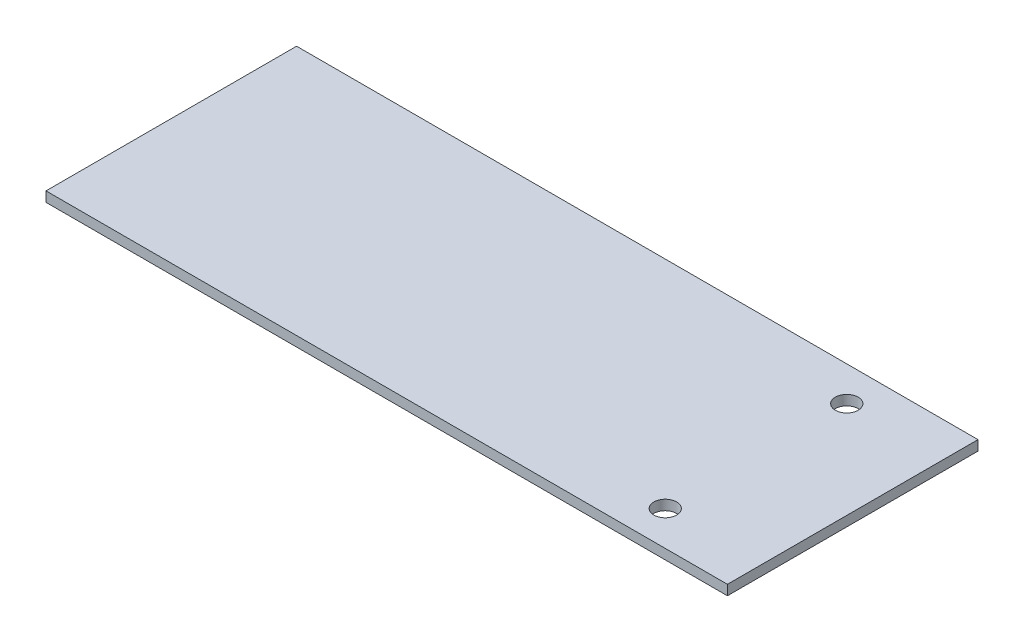
ISO-10303-21;
HEADER;
FILE_DESCRIPTION(('STEP AP214'),'2;1');
FILE_NAME('part.step','',(''),(''),'','','');
FILE_SCHEMA(('AUTOMOTIVE_DESIGN { 1 0 10303 214 1 1 1 1 }'));
ENDSEC;
DATA;
#1=APPLICATION_CONTEXT('core data for automotive mechanical design processes');
#2=APPLICATION_PROTOCOL_DEFINITION('international standard','automotive_design',2000,#1);
#3=PRODUCT_CONTEXT('',#1,'mechanical');
#4=PRODUCT('Part','Part','',(#3));
#5=PRODUCT_RELATED_PRODUCT_CATEGORY('part','',(#4));
#6=PRODUCT_DEFINITION_FORMATION('','',#4);
#7=PRODUCT_DEFINITION_CONTEXT('part definition',#1,'design');
#8=PRODUCT_DEFINITION('design','',#6,#7);
#9=PRODUCT_DEFINITION_SHAPE('','',#8);
#10=(LENGTH_UNIT() NAMED_UNIT(*) SI_UNIT(.MILLI.,.METRE.));
#11=(NAMED_UNIT(*) PLANE_ANGLE_UNIT() SI_UNIT($,.RADIAN.));
#12=(NAMED_UNIT(*) SI_UNIT($,.STERADIAN.) SOLID_ANGLE_UNIT());
#13=UNCERTAINTY_MEASURE_WITH_UNIT(LENGTH_MEASURE(1.E-05),#10,'distance_accuracy_value','');
#14=(GEOMETRIC_REPRESENTATION_CONTEXT(3) GLOBAL_UNCERTAINTY_ASSIGNED_CONTEXT((#13)) GLOBAL_UNIT_ASSIGNED_CONTEXT((#10,
#11,#12)) REPRESENTATION_CONTEXT('',''));
#15=CARTESIAN_POINT('',(0.,0.,0.));
#16=DIRECTION('',(0.,0.,1.));
#17=DIRECTION('',(1.,0.,0.));
#18=AXIS2_PLACEMENT_3D('',#15,#16,#17);
#19=CARTESIAN_POINT('',(56.985,1.67,20.955));
#20=DIRECTION('',(-1.,0.,0.));
#21=DIRECTION('',(0.,0.,1.));
#22=AXIS2_PLACEMENT_3D('',#19,#20,#21);
#23=PLANE('',#22);
#24=DIRECTION('',(0.,0.,-1.));
#25=VECTOR('',#24,1.);
#26=CARTESIAN_POINT('',(56.985,0.,20.955));
#27=LINE('',#26,#25);
#28=CARTESIAN_POINT('',(56.985,0.,20.955));
#29=VERTEX_POINT('',#28);
#30=CARTESIAN_POINT('',(56.985,0.,-20.955));
#31=VERTEX_POINT('',#30);
#32=EDGE_CURVE('E111',#29,#31,#27,.T.);
#33=ORIENTED_EDGE('',*,*,#32,.T.);
#34=DIRECTION('',(0.,-1.,0.));
#35=VECTOR('',#34,1.);
#36=CARTESIAN_POINT('',(56.985,1.67,-20.955));
#37=LINE('',#36,#35);
#38=CARTESIAN_POINT('',(56.985,1.67,-20.955));
#39=VERTEX_POINT('',#38);
#40=EDGE_CURVE('E11',#39,#31,#37,.T.);
#41=ORIENTED_EDGE('',*,*,#40,.F.);
#42=DIRECTION('',(0.,0.,-1.));
#43=VECTOR('',#42,1.);
#44=CARTESIAN_POINT('',(56.985,1.67,20.955));
#45=LINE('',#44,#43);
#46=CARTESIAN_POINT('',(56.985,1.67,20.955));
#47=VERTEX_POINT('',#46);
#48=EDGE_CURVE('E95',#47,#39,#45,.T.);
#49=ORIENTED_EDGE('',*,*,#48,.F.);
#50=DIRECTION('',(0.,-1.,0.));
#51=VECTOR('',#50,1.);
#52=CARTESIAN_POINT('',(56.985,1.67,20.955));
#53=LINE('',#52,#51);
#54=EDGE_CURVE('E107',#47,#29,#53,.T.);
#55=ORIENTED_EDGE('',*,*,#54,.T.);
#56=EDGE_LOOP('',(#33,#41,#49,#55));
#57=FACE_BOUND('',#56,.T.);
#58=ADVANCED_FACE('F43',(#57),#23,.F.);
#59=CARTESIAN_POINT('',(-56.985,1.67,-20.955));
#60=DIRECTION('',(0.,0.,1.));
#61=DIRECTION('',(1.,0.,0.));
#62=AXIS2_PLACEMENT_3D('',#59,#60,#61);
#63=PLANE('',#62);
#64=DIRECTION('',(-1.,0.,0.));
#65=VECTOR('',#64,1.);
#66=CARTESIAN_POINT('',(-56.985,0.,-20.955));
#67=LINE('',#66,#65);
#68=CARTESIAN_POINT('',(-56.985,0.,-20.955));
#69=VERTEX_POINT('',#68);
#70=EDGE_CURVE('E100',#31,#69,#67,.T.);
#71=ORIENTED_EDGE('',*,*,#70,.T.);
#72=DIRECTION('',(0.,-1.,0.));
#73=VECTOR('',#72,1.);
#74=CARTESIAN_POINT('',(-56.985,1.67,-20.955));
#75=LINE('',#74,#73);
#76=CARTESIAN_POINT('',(-56.985,1.67,-20.955));
#77=VERTEX_POINT('',#76);
#78=EDGE_CURVE('E52',#77,#69,#75,.T.);
#79=ORIENTED_EDGE('',*,*,#78,.F.);
#80=DIRECTION('',(-1.,0.,0.));
#81=VECTOR('',#80,1.);
#82=CARTESIAN_POINT('',(-56.985,1.67,-20.955));
#83=LINE('',#82,#81);
#84=EDGE_CURVE('E90',#39,#77,#83,.T.);
#85=ORIENTED_EDGE('',*,*,#84,.F.);
#86=ORIENTED_EDGE('',*,*,#40,.T.);
#87=EDGE_LOOP('',(#71,#79,#85,#86));
#88=FACE_BOUND('',#87,.T.);
#89=ADVANCED_FACE('F99',(#88),#63,.F.);
#90=CARTESIAN_POINT('',(-56.985,1.67,20.955));
#91=DIRECTION('',(1.,0.,0.));
#92=DIRECTION('',(0.,0.,-1.));
#93=AXIS2_PLACEMENT_3D('',#90,#91,#92);
#94=PLANE('',#93);
#95=DIRECTION('',(0.,0.,1.));
#96=VECTOR('',#95,1.);
#97=CARTESIAN_POINT('',(-56.985,0.,20.955));
#98=LINE('',#97,#96);
#99=CARTESIAN_POINT('',(-56.985,0.,20.955));
#100=VERTEX_POINT('',#99);
#101=EDGE_CURVE('E77',#69,#100,#98,.T.);
#102=ORIENTED_EDGE('',*,*,#101,.T.);
#103=DIRECTION('',(0.,-1.,0.));
#104=VECTOR('',#103,1.);
#105=CARTESIAN_POINT('',(-56.985,1.67,20.955));
#106=LINE('',#105,#104);
#107=CARTESIAN_POINT('',(-56.985,1.67,20.955));
#108=VERTEX_POINT('',#107);
#109=EDGE_CURVE('E102',#108,#100,#106,.T.);
#110=ORIENTED_EDGE('',*,*,#109,.F.);
#111=DIRECTION('',(0.,0.,1.));
#112=VECTOR('',#111,1.);
#113=CARTESIAN_POINT('',(-56.985,1.67,20.955));
#114=LINE('',#113,#112);
#115=EDGE_CURVE('E93',#77,#108,#114,.T.);
#116=ORIENTED_EDGE('',*,*,#115,.F.);
#117=ORIENTED_EDGE('',*,*,#78,.T.);
#118=EDGE_LOOP('',(#102,#110,#116,#117));
#119=FACE_BOUND('',#118,.T.);
#120=ADVANCED_FACE('F103',(#119),#94,.F.);
#121=CARTESIAN_POINT('',(-56.985,1.67,20.955));
#122=DIRECTION('',(0.,0.,-1.));
#123=DIRECTION('',(-1.,0.,0.));
#124=AXIS2_PLACEMENT_3D('',#121,#122,#123);
#125=PLANE('',#124);
#126=DIRECTION('',(1.,0.,0.));
#127=VECTOR('',#126,1.);
#128=CARTESIAN_POINT('',(-56.985,0.,20.955));
#129=LINE('',#128,#127);
#130=EDGE_CURVE('E83',#100,#29,#129,.T.);
#131=ORIENTED_EDGE('',*,*,#130,.T.);
#132=ORIENTED_EDGE('',*,*,#54,.F.);
#133=DIRECTION('',(1.,0.,0.));
#134=VECTOR('',#133,1.);
#135=CARTESIAN_POINT('',(-56.985,1.67,20.955));
#136=LINE('',#135,#134);
#137=EDGE_CURVE('E60',#108,#47,#136,.T.);
#138=ORIENTED_EDGE('',*,*,#137,.F.);
#139=ORIENTED_EDGE('',*,*,#109,.T.);
#140=EDGE_LOOP('',(#131,#132,#138,#139));
#141=FACE_BOUND('',#140,.T.);
#142=ADVANCED_FACE('F125',(#141),#125,.F.);
#143=CARTESIAN_POINT('',(0.,1.67,0.));
#144=DIRECTION('',(0.,-1.,0.));
#145=DIRECTION('',(0.,0.,-1.));
#146=AXIS2_PLACEMENT_3D('',#143,#144,#145);
#147=PLANE('',#146);
#148=CARTESIAN_POINT('',(40.8075,1.67,-15.18));
#149=DIRECTION('',(0.,1.,0.));
#150=DIRECTION('',(0.,0.,1.));
#151=AXIS2_PLACEMENT_3D('',#148,#149,#150);
#152=CIRCLE('',#151,1.9075);
#153=CARTESIAN_POINT('',(40.8075,1.67,-13.2725));
#154=VERTEX_POINT('',#153);
#155=EDGE_CURVE('E140',#154,#154,#152,.T.);
#156=ORIENTED_EDGE('',*,*,#155,.F.);
#157=EDGE_LOOP('',(#156));
#158=FACE_BOUND('',#157,.T.);
#159=CARTESIAN_POINT('',(40.8075,1.67,15.18));
#160=DIRECTION('',(0.,1.,0.));
#161=DIRECTION('',(0.,0.,1.));
#162=AXIS2_PLACEMENT_3D('',#159,#160,#161);
#163=CIRCLE('',#162,1.9075);
#164=CARTESIAN_POINT('',(40.8075,1.67,17.0875));
#165=VERTEX_POINT('',#164);
#166=EDGE_CURVE('E136',#165,#165,#163,.T.);
#167=ORIENTED_EDGE('',*,*,#166,.F.);
#168=EDGE_LOOP('',(#167));
#169=FACE_BOUND('',#168,.T.);
#170=ORIENTED_EDGE('',*,*,#48,.T.);
#171=ORIENTED_EDGE('',*,*,#84,.T.);
#172=ORIENTED_EDGE('',*,*,#115,.T.);
#173=ORIENTED_EDGE('',*,*,#137,.T.);
#174=EDGE_LOOP('',(#170,#171,#172,#173));
#175=FACE_BOUND('',#174,.T.);
#176=ADVANCED_FACE('F91',(#158,#169,#175),#147,.F.);
#177=CARTESIAN_POINT('',(0.,0.,0.));
#178=DIRECTION('',(0.,-1.,0.));
#179=DIRECTION('',(0.,0.,-1.));
#180=AXIS2_PLACEMENT_3D('',#177,#178,#179);
#181=PLANE('',#180);
#182=CARTESIAN_POINT('',(40.8075,0.,-15.18));
#183=DIRECTION('',(0.,1.,0.));
#184=DIRECTION('',(0.,0.,1.));
#185=AXIS2_PLACEMENT_3D('',#182,#183,#184);
#186=CIRCLE('',#185,1.9075);
#187=CARTESIAN_POINT('',(40.8075,0.,-13.2725));
#188=VERTEX_POINT('',#187);
#189=EDGE_CURVE('E115',#188,#188,#186,.T.);
#190=ORIENTED_EDGE('',*,*,#189,.T.);
#191=EDGE_LOOP('',(#190));
#192=FACE_BOUND('',#191,.T.);
#193=CARTESIAN_POINT('',(40.8075,0.,15.18));
#194=DIRECTION('',(0.,1.,0.));
#195=DIRECTION('',(0.,0.,1.));
#196=AXIS2_PLACEMENT_3D('',#193,#194,#195);
#197=CIRCLE('',#196,1.9075);
#198=CARTESIAN_POINT('',(40.8075,0.,17.0875));
#199=VERTEX_POINT('',#198);
#200=EDGE_CURVE('E132',#199,#199,#197,.T.);
#201=ORIENTED_EDGE('',*,*,#200,.T.);
#202=EDGE_LOOP('',(#201));
#203=FACE_BOUND('',#202,.T.);
#204=ORIENTED_EDGE('',*,*,#32,.F.);
#205=ORIENTED_EDGE('',*,*,#130,.F.);
#206=ORIENTED_EDGE('',*,*,#101,.F.);
#207=ORIENTED_EDGE('',*,*,#70,.F.);
#208=EDGE_LOOP('',(#204,#205,#206,#207));
#209=FACE_BOUND('',#208,.T.);
#210=ADVANCED_FACE('F128',(#192,#203,#209),#181,.T.);
#211=CARTESIAN_POINT('',(40.8075,0.,15.18));
#212=DIRECTION('',(0.,1.,0.));
#213=DIRECTION('',(0.,0.,1.));
#214=AXIS2_PLACEMENT_3D('',#211,#212,#213);
#215=CYLINDRICAL_SURFACE('',#214,1.9075);
#216=ORIENTED_EDGE('',*,*,#200,.F.);
#217=EDGE_LOOP('',(#216));
#218=FACE_BOUND('',#217,.T.);
#219=ORIENTED_EDGE('',*,*,#166,.T.);
#220=EDGE_LOOP('',(#219));
#221=FACE_BOUND('',#220,.T.);
#222=ADVANCED_FACE('F153',(#218,#221),#215,.F.);
#223=CARTESIAN_POINT('',(40.8075,0.,-15.18));
#224=DIRECTION('',(0.,1.,0.));
#225=DIRECTION('',(0.,0.,1.));
#226=AXIS2_PLACEMENT_3D('',#223,#224,#225);
#227=CYLINDRICAL_SURFACE('',#226,1.9075);
#228=ORIENTED_EDGE('',*,*,#189,.F.);
#229=EDGE_LOOP('',(#228));
#230=FACE_BOUND('',#229,.T.);
#231=ORIENTED_EDGE('',*,*,#155,.T.);
#232=EDGE_LOOP('',(#231));
#233=FACE_BOUND('',#232,.T.);
#234=ADVANCED_FACE('F150',(#230,#233),#227,.F.);
#235=CLOSED_SHELL('',(#58,#89,#120,#142,#176,#210,#222,#234));
#236=MANIFOLD_SOLID_BREP('B2',#235);
#237=ADVANCED_BREP_SHAPE_REPRESENTATION('',(#18,#236),#14);
#238=SHAPE_DEFINITION_REPRESENTATION(#9,#237);
ENDSEC;
END-ISO-10303-21;
